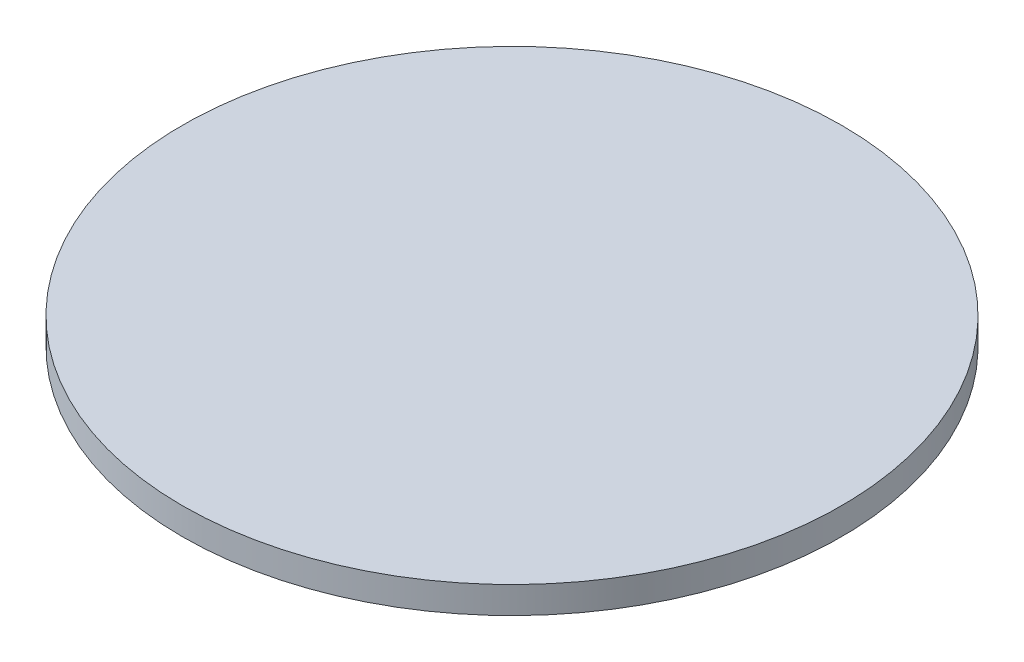
ISO-10303-21;
HEADER;
FILE_DESCRIPTION(('STEP AP214'),'2;1');
FILE_NAME('part.step','',(''),(''),'','','');
FILE_SCHEMA(('AUTOMOTIVE_DESIGN { 1 0 10303 214 1 1 1 1 }'));
ENDSEC;
DATA;
#1=APPLICATION_CONTEXT('core data for automotive mechanical design processes');
#2=APPLICATION_PROTOCOL_DEFINITION('international standard','automotive_design',2000,#1);
#3=PRODUCT_CONTEXT('',#1,'mechanical');
#4=PRODUCT('Part','Part','',(#3));
#5=PRODUCT_RELATED_PRODUCT_CATEGORY('part','',(#4));
#6=PRODUCT_DEFINITION_FORMATION('','',#4);
#7=PRODUCT_DEFINITION_CONTEXT('part definition',#1,'design');
#8=PRODUCT_DEFINITION('design','',#6,#7);
#9=PRODUCT_DEFINITION_SHAPE('','',#8);
#10=(LENGTH_UNIT() NAMED_UNIT(*) SI_UNIT(.MILLI.,.METRE.));
#11=(NAMED_UNIT(*) PLANE_ANGLE_UNIT() SI_UNIT($,.RADIAN.));
#12=(NAMED_UNIT(*) SI_UNIT($,.STERADIAN.) SOLID_ANGLE_UNIT());
#13=UNCERTAINTY_MEASURE_WITH_UNIT(LENGTH_MEASURE(1.E-05),#10,'distance_accuracy_value','');
#14=(GEOMETRIC_REPRESENTATION_CONTEXT(3) GLOBAL_UNCERTAINTY_ASSIGNED_CONTEXT((#13)) GLOBAL_UNIT_ASSIGNED_CONTEXT((#10,
#11,#12)) REPRESENTATION_CONTEXT('',''));
#15=CARTESIAN_POINT('',(0.,0.,0.));
#16=DIRECTION('',(0.,0.,1.));
#17=DIRECTION('',(1.,0.,0.));
#18=AXIS2_PLACEMENT_3D('',#15,#16,#17);
#19=CARTESIAN_POINT('',(0.,4.,0.));
#20=DIRECTION('',(0.,-1.,0.));
#21=DIRECTION('',(0.,0.,-1.));
#22=AXIS2_PLACEMENT_3D('',#19,#20,#21);
#23=CYLINDRICAL_SURFACE('',#22,49.);
#24=CARTESIAN_POINT('',(0.,4.,0.));
#25=DIRECTION('',(0.,1.,0.));
#26=DIRECTION('',(0.,0.,1.));
#27=AXIS2_PLACEMENT_3D('',#24,#25,#26);
#28=CIRCLE('',#27,49.);
#29=CARTESIAN_POINT('',(0.,4.,49.));
#30=VERTEX_POINT('',#29);
#31=EDGE_CURVE('E10',#30,#30,#28,.T.);
#32=ORIENTED_EDGE('',*,*,#31,.F.);
#33=EDGE_LOOP('',(#32));
#34=FACE_BOUND('',#33,.T.);
#35=CARTESIAN_POINT('',(0.,0.,0.));
#36=DIRECTION('',(0.,1.,0.));
#37=DIRECTION('',(0.,0.,1.));
#38=AXIS2_PLACEMENT_3D('',#35,#36,#37);
#39=CIRCLE('',#38,49.);
#40=CARTESIAN_POINT('',(0.,0.,49.));
#41=VERTEX_POINT('',#40);
#42=EDGE_CURVE('E36',#41,#41,#39,.T.);
#43=ORIENTED_EDGE('',*,*,#42,.T.);
#44=EDGE_LOOP('',(#43));
#45=FACE_BOUND('',#44,.T.);
#46=ADVANCED_FACE('F33',(#34,#45),#23,.T.);
#47=CARTESIAN_POINT('',(0.,4.,0.));
#48=DIRECTION('',(0.,1.,0.));
#49=DIRECTION('',(0.,0.,1.));
#50=AXIS2_PLACEMENT_3D('',#47,#48,#49);
#51=PLANE('',#50);
#52=ORIENTED_EDGE('',*,*,#31,.T.);
#53=EDGE_LOOP('',(#52));
#54=FACE_BOUND('',#53,.T.);
#55=ADVANCED_FACE('F48',(#54),#51,.T.);
#56=CARTESIAN_POINT('',(0.,0.,0.));
#57=DIRECTION('',(0.,1.,0.));
#58=DIRECTION('',(0.,0.,1.));
#59=AXIS2_PLACEMENT_3D('',#56,#57,#58);
#60=PLANE('',#59);
#61=ORIENTED_EDGE('',*,*,#42,.F.);
#62=EDGE_LOOP('',(#61));
#63=FACE_BOUND('',#62,.T.);
#64=ADVANCED_FACE('F46',(#63),#60,.F.);
#65=CLOSED_SHELL('',(#46,#55,#64));
#66=MANIFOLD_SOLID_BREP('B2',#65);
#67=ADVANCED_BREP_SHAPE_REPRESENTATION('',(#18,#66),#14);
#68=SHAPE_DEFINITION_REPRESENTATION(#9,#67);
ENDSEC;
END-ISO-10303-21;
